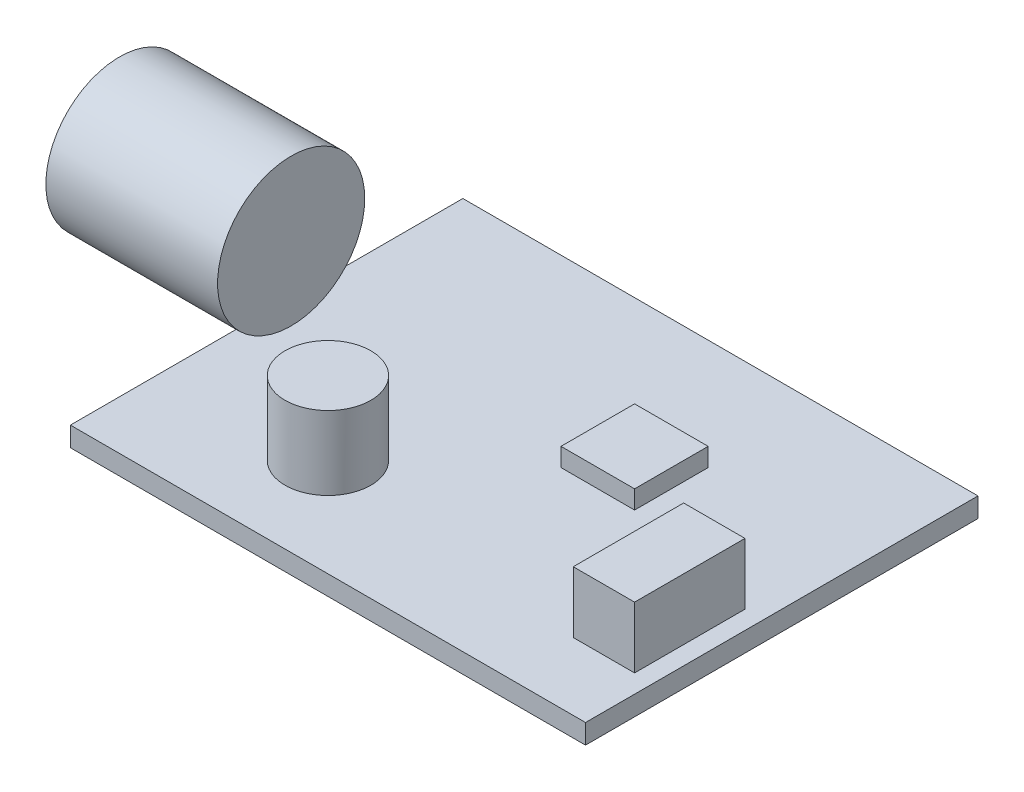
ISO-10303-21;
HEADER;
FILE_DESCRIPTION(('STEP AP214'),'2;1');
FILE_NAME('part.step','',(''),(''),'','','');
FILE_SCHEMA(('AUTOMOTIVE_DESIGN { 1 0 10303 214 1 1 1 1 }'));
ENDSEC;
DATA;
#1=APPLICATION_CONTEXT('core data for automotive mechanical design processes');
#2=APPLICATION_PROTOCOL_DEFINITION('international standard','automotive_design',2000,#1);
#3=PRODUCT_CONTEXT('',#1,'mechanical');
#4=PRODUCT('Part','Part','',(#3));
#5=PRODUCT_RELATED_PRODUCT_CATEGORY('part','',(#4));
#6=PRODUCT_DEFINITION_FORMATION('','',#4);
#7=PRODUCT_DEFINITION_CONTEXT('part definition',#1,'design');
#8=PRODUCT_DEFINITION('design','',#6,#7);
#9=PRODUCT_DEFINITION_SHAPE('','',#8);
#10=(LENGTH_UNIT() NAMED_UNIT(*) SI_UNIT(.MILLI.,.METRE.));
#11=(NAMED_UNIT(*) PLANE_ANGLE_UNIT() SI_UNIT($,.RADIAN.));
#12=(NAMED_UNIT(*) SI_UNIT($,.STERADIAN.) SOLID_ANGLE_UNIT());
#13=UNCERTAINTY_MEASURE_WITH_UNIT(LENGTH_MEASURE(1.E-05),#10,'distance_accuracy_value','');
#14=(GEOMETRIC_REPRESENTATION_CONTEXT(3) GLOBAL_UNCERTAINTY_ASSIGNED_CONTEXT((#13)) GLOBAL_UNIT_ASSIGNED_CONTEXT((#10,
#11,#12)) REPRESENTATION_CONTEXT('',''));
#15=CARTESIAN_POINT('',(0.,0.,0.));
#16=DIRECTION('',(0.,0.,1.));
#17=DIRECTION('',(1.,0.,0.));
#18=AXIS2_PLACEMENT_3D('',#15,#16,#17);
#19=CARTESIAN_POINT('',(-19.,7.6,0.));
#20=DIRECTION('',(-1.,0.,0.));
#21=DIRECTION('',(0.,0.,1.));
#22=AXIS2_PLACEMENT_3D('',#19,#20,#21);
#23=CYLINDRICAL_SURFACE('',#22,6.);
#24=CARTESIAN_POINT('',(-19.,7.6,0.));
#25=DIRECTION('',(1.,0.,0.));
#26=DIRECTION('',(0.,0.,-1.));
#27=AXIS2_PLACEMENT_3D('',#24,#25,#26);
#28=CIRCLE('',#27,6.);
#29=CARTESIAN_POINT('',(-19.,7.6,-6.));
#30=VERTEX_POINT('',#29);
#31=EDGE_CURVE('E11',#30,#30,#28,.T.);
#32=ORIENTED_EDGE('',*,*,#31,.F.);
#33=EDGE_LOOP('',(#32));
#34=FACE_BOUND('',#33,.T.);
#35=CARTESIAN_POINT('',(-33.,7.6,0.));
#36=DIRECTION('',(1.,0.,0.));
#37=DIRECTION('',(0.,0.,-1.));
#38=AXIS2_PLACEMENT_3D('',#35,#36,#37);
#39=CIRCLE('',#38,6.);
#40=CARTESIAN_POINT('',(-33.,7.6,-6.));
#41=VERTEX_POINT('',#40);
#42=EDGE_CURVE('E58',#41,#41,#39,.T.);
#43=ORIENTED_EDGE('',*,*,#42,.T.);
#44=EDGE_LOOP('',(#43));
#45=FACE_BOUND('',#44,.T.);
#46=ADVANCED_FACE('F60',(#34,#45),#23,.T.);
#47=CARTESIAN_POINT('',(-19.,7.6,0.));
#48=DIRECTION('',(1.,0.,0.));
#49=DIRECTION('',(0.,0.,-1.));
#50=AXIS2_PLACEMENT_3D('',#47,#48,#49);
#51=PLANE('',#50);
#52=ORIENTED_EDGE('',*,*,#31,.T.);
#53=EDGE_LOOP('',(#52));
#54=FACE_BOUND('',#53,.T.);
#55=ADVANCED_FACE('F75',(#54),#51,.T.);
#56=CARTESIAN_POINT('',(-33.,7.6,0.));
#57=DIRECTION('',(1.,0.,0.));
#58=DIRECTION('',(0.,0.,-1.));
#59=AXIS2_PLACEMENT_3D('',#56,#57,#58);
#60=PLANE('',#59);
#61=ORIENTED_EDGE('',*,*,#42,.F.);
#62=EDGE_LOOP('',(#61));
#63=FACE_BOUND('',#62,.T.);
#64=ADVANCED_FACE('F68',(#63),#60,.F.);
#65=CLOSED_SHELL('',(#46,#55,#64));
#66=MANIFOLD_SOLID_BREP('B2',#65);
#67=CARTESIAN_POINT('',(0.,1.6,0.));
#68=DIRECTION('',(0.,-1.,0.));
#69=DIRECTION('',(0.,0.,-1.));
#70=AXIS2_PLACEMENT_3D('',#67,#68,#69);
#71=PLANE('',#70);
#72=CARTESIAN_POINT('',(-8.,1.6,8.));
#73=DIRECTION('',(0.,-1.,0.));
#74=DIRECTION('',(0.,0.,-1.));
#75=AXIS2_PLACEMENT_3D('',#72,#73,#74);
#76=CIRCLE('',#75,3.5);
#77=CARTESIAN_POINT('',(-8.,1.6,4.5));
#78=VERTEX_POINT('',#77);
#79=EDGE_CURVE('E54',#78,#78,#76,.F.);
#80=ORIENTED_EDGE('',*,*,#79,.F.);
#81=EDGE_LOOP('',(#80));
#82=FACE_BOUND('',#81,.T.);
#83=DIRECTION('',(0.,0.,-1.));
#84=VECTOR('',#83,1.);
#85=CARTESIAN_POINT('',(8.,1.6,-1.));
#86=LINE('',#85,#84);
#87=CARTESIAN_POINT('',(8.,1.6,-1.));
#88=VERTEX_POINT('',#87);
#89=CARTESIAN_POINT('',(8.,1.6,-7.));
#90=VERTEX_POINT('',#89);
#91=EDGE_CURVE('E221',#88,#90,#86,.T.);
#92=ORIENTED_EDGE('',*,*,#91,.F.);
#93=DIRECTION('',(1.,0.,0.));
#94=VECTOR('',#93,1.);
#95=CARTESIAN_POINT('',(2.,1.6,-1.));
#96=LINE('',#95,#94);
#97=CARTESIAN_POINT('',(2.,1.6,-1.));
#98=VERTEX_POINT('',#97);
#99=EDGE_CURVE('E238',#98,#88,#96,.T.);
#100=ORIENTED_EDGE('',*,*,#99,.F.);
#101=DIRECTION('',(0.,0.,1.));
#102=VECTOR('',#101,1.);
#103=CARTESIAN_POINT('',(2.,1.6,-1.));
#104=LINE('',#103,#102);
#105=CARTESIAN_POINT('',(2.,1.6,-7.));
#106=VERTEX_POINT('',#105);
#107=EDGE_CURVE('E251',#106,#98,#104,.T.);
#108=ORIENTED_EDGE('',*,*,#107,.F.);
#109=DIRECTION('',(-1.,0.,0.));
#110=VECTOR('',#109,1.);
#111=CARTESIAN_POINT('',(2.,1.6,-7.));
#112=LINE('',#111,#110);
#113=EDGE_CURVE('E230',#90,#106,#112,.T.);
#114=ORIENTED_EDGE('',*,*,#113,.F.);
#115=EDGE_LOOP('',(#92,#100,#108,#114));
#116=FACE_BOUND('',#115,.T.);
#117=DIRECTION('',(0.,0.,-1.));
#118=VECTOR('',#117,1.);
#119=CARTESIAN_POINT('',(21.,1.6,16.));
#120=LINE('',#119,#118);
#121=CARTESIAN_POINT('',(21.,1.6,16.));
#122=VERTEX_POINT('',#121);
#123=CARTESIAN_POINT('',(21.,1.6,-16.));
#124=VERTEX_POINT('',#123);
#125=EDGE_CURVE('E277',#122,#124,#120,.T.);
#126=ORIENTED_EDGE('',*,*,#125,.T.);
#127=DIRECTION('',(-1.,0.,0.));
#128=VECTOR('',#127,1.);
#129=CARTESIAN_POINT('',(-21.,1.6,-16.));
#130=LINE('',#129,#128);
#131=CARTESIAN_POINT('',(-21.,1.6,-16.));
#132=VERTEX_POINT('',#131);
#133=EDGE_CURVE('E278',#124,#132,#130,.T.);
#134=ORIENTED_EDGE('',*,*,#133,.T.);
#135=DIRECTION('',(0.,0.,1.));
#136=VECTOR('',#135,1.);
#137=CARTESIAN_POINT('',(-21.,1.6,16.));
#138=LINE('',#137,#136);
#139=CARTESIAN_POINT('',(-21.,1.6,16.));
#140=VERTEX_POINT('',#139);
#141=EDGE_CURVE('E285',#132,#140,#138,.T.);
#142=ORIENTED_EDGE('',*,*,#141,.T.);
#143=DIRECTION('',(1.,0.,0.));
#144=VECTOR('',#143,1.);
#145=CARTESIAN_POINT('',(-21.,1.6,16.));
#146=LINE('',#145,#144);
#147=EDGE_CURVE('E289',#140,#122,#146,.T.);
#148=ORIENTED_EDGE('',*,*,#147,.T.);
#149=EDGE_LOOP('',(#126,#134,#142,#148));
#150=FACE_BOUND('',#149,.T.);
#151=DIRECTION('',(0.,0.,-1.));
#152=VECTOR('',#151,1.);
#153=CARTESIAN_POINT('',(19.5,1.6,10.5));
#154=LINE('',#153,#152);
#155=CARTESIAN_POINT('',(19.5,1.6,10.5));
#156=VERTEX_POINT('',#155);
#157=CARTESIAN_POINT('',(19.5,1.6,1.5));
#158=VERTEX_POINT('',#157);
#159=EDGE_CURVE('E225',#156,#158,#154,.T.);
#160=ORIENTED_EDGE('',*,*,#159,.F.);
#161=DIRECTION('',(1.,0.,0.));
#162=VECTOR('',#161,1.);
#163=CARTESIAN_POINT('',(14.5,1.6,10.5));
#164=LINE('',#163,#162);
#165=CARTESIAN_POINT('',(14.5,1.6,10.5));
#166=VERTEX_POINT('',#165);
#167=EDGE_CURVE('E218',#166,#156,#164,.T.);
#168=ORIENTED_EDGE('',*,*,#167,.F.);
#169=DIRECTION('',(0.,0.,1.));
#170=VECTOR('',#169,1.);
#171=CARTESIAN_POINT('',(14.5,1.6,10.5));
#172=LINE('',#171,#170);
#173=CARTESIAN_POINT('',(14.5,1.6,1.5));
#174=VERTEX_POINT('',#173);
#175=EDGE_CURVE('E133',#174,#166,#172,.T.);
#176=ORIENTED_EDGE('',*,*,#175,.F.);
#177=DIRECTION('',(-1.,0.,0.));
#178=VECTOR('',#177,1.);
#179=CARTESIAN_POINT('',(14.5,1.6,1.5));
#180=LINE('',#179,#178);
#181=EDGE_CURVE('E127',#158,#174,#180,.T.);
#182=ORIENTED_EDGE('',*,*,#181,.F.);
#183=EDGE_LOOP('',(#160,#168,#176,#182));
#184=FACE_BOUND('',#183,.T.);
#185=ADVANCED_FACE('F109',(#82,#116,#150,#184),#71,.F.);
#186=CARTESIAN_POINT('',(21.,1.6,16.));
#187=DIRECTION('',(-1.,0.,0.));
#188=DIRECTION('',(0.,0.,1.));
#189=AXIS2_PLACEMENT_3D('',#186,#187,#188);
#190=PLANE('',#189);
#191=DIRECTION('',(0.,0.,-1.));
#192=VECTOR('',#191,1.);
#193=CARTESIAN_POINT('',(21.,0.,16.));
#194=LINE('',#193,#192);
#195=CARTESIAN_POINT('',(21.,0.,16.));
#196=VERTEX_POINT('',#195);
#197=CARTESIAN_POINT('',(21.,0.,-16.));
#198=VERTEX_POINT('',#197);
#199=EDGE_CURVE('E274',#196,#198,#194,.T.);
#200=ORIENTED_EDGE('',*,*,#199,.T.);
#201=DIRECTION('',(0.,-1.,0.));
#202=VECTOR('',#201,1.);
#203=CARTESIAN_POINT('',(21.,1.6,-16.));
#204=LINE('',#203,#202);
#205=EDGE_CURVE('E120',#124,#198,#204,.T.);
#206=ORIENTED_EDGE('',*,*,#205,.F.);
#207=ORIENTED_EDGE('',*,*,#125,.F.);
#208=DIRECTION('',(0.,-1.,0.));
#209=VECTOR('',#208,1.);
#210=CARTESIAN_POINT('',(21.,1.6,16.));
#211=LINE('',#210,#209);
#212=EDGE_CURVE('E288',#122,#196,#211,.T.);
#213=ORIENTED_EDGE('',*,*,#212,.T.);
#214=EDGE_LOOP('',(#200,#206,#207,#213));
#215=FACE_BOUND('',#214,.T.);
#216=ADVANCED_FACE('F115',(#215),#190,.F.);
#217=CARTESIAN_POINT('',(-21.,1.6,-16.));
#218=DIRECTION('',(0.,0.,1.));
#219=DIRECTION('',(1.,0.,0.));
#220=AXIS2_PLACEMENT_3D('',#217,#218,#219);
#221=PLANE('',#220);
#222=DIRECTION('',(-1.,0.,0.));
#223=VECTOR('',#222,1.);
#224=CARTESIAN_POINT('',(-21.,0.,-16.));
#225=LINE('',#224,#223);
#226=CARTESIAN_POINT('',(-21.,0.,-16.));
#227=VERTEX_POINT('',#226);
#228=EDGE_CURVE('E294',#198,#227,#225,.T.);
#229=ORIENTED_EDGE('',*,*,#228,.T.);
#230=DIRECTION('',(0.,-1.,0.));
#231=VECTOR('',#230,1.);
#232=CARTESIAN_POINT('',(-21.,1.6,-16.));
#233=LINE('',#232,#231);
#234=EDGE_CURVE('E310',#132,#227,#233,.T.);
#235=ORIENTED_EDGE('',*,*,#234,.F.);
#236=ORIENTED_EDGE('',*,*,#133,.F.);
#237=ORIENTED_EDGE('',*,*,#205,.T.);
#238=EDGE_LOOP('',(#229,#235,#236,#237));
#239=FACE_BOUND('',#238,.T.);
#240=ADVANCED_FACE('F316',(#239),#221,.F.);
#241=CARTESIAN_POINT('',(-21.,1.6,16.));
#242=DIRECTION('',(1.,0.,0.));
#243=DIRECTION('',(0.,0.,-1.));
#244=AXIS2_PLACEMENT_3D('',#241,#242,#243);
#245=PLANE('',#244);
#246=DIRECTION('',(0.,0.,1.));
#247=VECTOR('',#246,1.);
#248=CARTESIAN_POINT('',(-21.,0.,16.));
#249=LINE('',#248,#247);
#250=CARTESIAN_POINT('',(-21.,0.,16.));
#251=VERTEX_POINT('',#250);
#252=EDGE_CURVE('E299',#227,#251,#249,.T.);
#253=ORIENTED_EDGE('',*,*,#252,.T.);
#254=DIRECTION('',(0.,-1.,0.));
#255=VECTOR('',#254,1.);
#256=CARTESIAN_POINT('',(-21.,1.6,16.));
#257=LINE('',#256,#255);
#258=EDGE_CURVE('E303',#140,#251,#257,.T.);
#259=ORIENTED_EDGE('',*,*,#258,.F.);
#260=ORIENTED_EDGE('',*,*,#141,.F.);
#261=ORIENTED_EDGE('',*,*,#234,.T.);
#262=EDGE_LOOP('',(#253,#259,#260,#261));
#263=FACE_BOUND('',#262,.T.);
#264=ADVANCED_FACE('F327',(#263),#245,.F.);
#265=CARTESIAN_POINT('',(-21.,1.6,16.));
#266=DIRECTION('',(0.,0.,-1.));
#267=DIRECTION('',(-1.,0.,0.));
#268=AXIS2_PLACEMENT_3D('',#265,#266,#267);
#269=PLANE('',#268);
#270=DIRECTION('',(1.,0.,0.));
#271=VECTOR('',#270,1.);
#272=CARTESIAN_POINT('',(-21.,0.,16.));
#273=LINE('',#272,#271);
#274=EDGE_CURVE('E283',#251,#196,#273,.T.);
#275=ORIENTED_EDGE('',*,*,#274,.T.);
#276=ORIENTED_EDGE('',*,*,#212,.F.);
#277=ORIENTED_EDGE('',*,*,#147,.F.);
#278=ORIENTED_EDGE('',*,*,#258,.T.);
#279=EDGE_LOOP('',(#275,#276,#277,#278));
#280=FACE_BOUND('',#279,.T.);
#281=ADVANCED_FACE('F335',(#280),#269,.F.);
#282=CARTESIAN_POINT('',(0.,0.,0.));
#283=DIRECTION('',(0.,-1.,0.));
#284=DIRECTION('',(0.,0.,-1.));
#285=AXIS2_PLACEMENT_3D('',#282,#283,#284);
#286=PLANE('',#285);
#287=ORIENTED_EDGE('',*,*,#199,.F.);
#288=ORIENTED_EDGE('',*,*,#274,.F.);
#289=ORIENTED_EDGE('',*,*,#252,.F.);
#290=ORIENTED_EDGE('',*,*,#228,.F.);
#291=EDGE_LOOP('',(#287,#288,#289,#290));
#292=FACE_BOUND('',#291,.T.);
#293=ADVANCED_FACE('F322',(#292),#286,.T.);
#294=CARTESIAN_POINT('',(8.,3.1,-1.));
#295=DIRECTION('',(-1.,0.,0.));
#296=DIRECTION('',(0.,0.,1.));
#297=AXIS2_PLACEMENT_3D('',#294,#295,#296);
#298=PLANE('',#297);
#299=ORIENTED_EDGE('',*,*,#91,.T.);
#300=DIRECTION('',(0.,-1.,0.));
#301=VECTOR('',#300,1.);
#302=CARTESIAN_POINT('',(8.,3.1,-7.));
#303=LINE('',#302,#301);
#304=CARTESIAN_POINT('',(8.,3.1,-7.));
#305=VERTEX_POINT('',#304);
#306=EDGE_CURVE('E271',#305,#90,#303,.T.);
#307=ORIENTED_EDGE('',*,*,#306,.F.);
#308=DIRECTION('',(0.,0.,-1.));
#309=VECTOR('',#308,1.);
#310=CARTESIAN_POINT('',(8.,3.1,-1.));
#311=LINE('',#310,#309);
#312=CARTESIAN_POINT('',(8.,3.1,-1.));
#313=VERTEX_POINT('',#312);
#314=EDGE_CURVE('E233',#313,#305,#311,.T.);
#315=ORIENTED_EDGE('',*,*,#314,.F.);
#316=DIRECTION('',(0.,-1.,0.));
#317=VECTOR('',#316,1.);
#318=CARTESIAN_POINT('',(8.,3.1,-1.));
#319=LINE('',#318,#317);
#320=EDGE_CURVE('E250',#313,#88,#319,.T.);
#321=ORIENTED_EDGE('',*,*,#320,.T.);
#322=EDGE_LOOP('',(#299,#307,#315,#321));
#323=FACE_BOUND('',#322,.T.);
#324=ADVANCED_FACE('F379',(#323),#298,.F.);
#325=CARTESIAN_POINT('',(2.,3.1,-7.));
#326=DIRECTION('',(0.,0.,1.));
#327=DIRECTION('',(1.,0.,0.));
#328=AXIS2_PLACEMENT_3D('',#325,#326,#327);
#329=PLANE('',#328);
#330=ORIENTED_EDGE('',*,*,#113,.T.);
#331=DIRECTION('',(0.,-1.,0.));
#332=VECTOR('',#331,1.);
#333=CARTESIAN_POINT('',(2.,3.1,-7.));
#334=LINE('',#333,#332);
#335=CARTESIAN_POINT('',(2.,3.1,-7.));
#336=VERTEX_POINT('',#335);
#337=EDGE_CURVE('E270',#336,#106,#334,.T.);
#338=ORIENTED_EDGE('',*,*,#337,.F.);
#339=DIRECTION('',(-1.,0.,0.));
#340=VECTOR('',#339,1.);
#341=CARTESIAN_POINT('',(2.,3.1,-7.));
#342=LINE('',#341,#340);
#343=EDGE_CURVE('E239',#305,#336,#342,.T.);
#344=ORIENTED_EDGE('',*,*,#343,.F.);
#345=ORIENTED_EDGE('',*,*,#306,.T.);
#346=EDGE_LOOP('',(#330,#338,#344,#345));
#347=FACE_BOUND('',#346,.T.);
#348=ADVANCED_FACE('F389',(#347),#329,.F.);
#349=CARTESIAN_POINT('',(2.,3.1,-1.));
#350=DIRECTION('',(1.,0.,0.));
#351=DIRECTION('',(0.,0.,-1.));
#352=AXIS2_PLACEMENT_3D('',#349,#350,#351);
#353=PLANE('',#352);
#354=ORIENTED_EDGE('',*,*,#107,.T.);
#355=DIRECTION('',(0.,-1.,0.));
#356=VECTOR('',#355,1.);
#357=CARTESIAN_POINT('',(2.,3.1,-1.));
#358=LINE('',#357,#356);
#359=CARTESIAN_POINT('',(2.,3.1,-1.));
#360=VERTEX_POINT('',#359);
#361=EDGE_CURVE('E263',#360,#98,#358,.T.);
#362=ORIENTED_EDGE('',*,*,#361,.F.);
#363=DIRECTION('',(0.,0.,1.));
#364=VECTOR('',#363,1.);
#365=CARTESIAN_POINT('',(2.,3.1,-1.));
#366=LINE('',#365,#364);
#367=EDGE_CURVE('E242',#336,#360,#366,.T.);
#368=ORIENTED_EDGE('',*,*,#367,.F.);
#369=ORIENTED_EDGE('',*,*,#337,.T.);
#370=EDGE_LOOP('',(#354,#362,#368,#369));
#371=FACE_BOUND('',#370,.T.);
#372=ADVANCED_FACE('F387',(#371),#353,.F.);
#373=CARTESIAN_POINT('',(2.,3.1,-1.));
#374=DIRECTION('',(0.,0.,-1.));
#375=DIRECTION('',(-1.,0.,0.));
#376=AXIS2_PLACEMENT_3D('',#373,#374,#375);
#377=PLANE('',#376);
#378=ORIENTED_EDGE('',*,*,#99,.T.);
#379=ORIENTED_EDGE('',*,*,#320,.F.);
#380=DIRECTION('',(1.,0.,0.));
#381=VECTOR('',#380,1.);
#382=CARTESIAN_POINT('',(2.,3.1,-1.));
#383=LINE('',#382,#381);
#384=EDGE_CURVE('E247',#360,#313,#383,.T.);
#385=ORIENTED_EDGE('',*,*,#384,.F.);
#386=ORIENTED_EDGE('',*,*,#361,.T.);
#387=EDGE_LOOP('',(#378,#379,#385,#386));
#388=FACE_BOUND('',#387,.T.);
#389=ADVANCED_FACE('F376',(#388),#377,.F.);
#390=CARTESIAN_POINT('',(0.,3.1,0.));
#391=DIRECTION('',(0.,-1.,0.));
#392=DIRECTION('',(0.,0.,-1.));
#393=AXIS2_PLACEMENT_3D('',#390,#391,#392);
#394=PLANE('',#393);
#395=ORIENTED_EDGE('',*,*,#314,.T.);
#396=ORIENTED_EDGE('',*,*,#343,.T.);
#397=ORIENTED_EDGE('',*,*,#367,.T.);
#398=ORIENTED_EDGE('',*,*,#384,.T.);
#399=EDGE_LOOP('',(#395,#396,#397,#398));
#400=FACE_BOUND('',#399,.T.);
#401=ADVANCED_FACE('F385',(#400),#394,.F.);
#402=CARTESIAN_POINT('',(19.5,6.6,10.5));
#403=DIRECTION('',(-1.,0.,0.));
#404=DIRECTION('',(0.,0.,1.));
#405=AXIS2_PLACEMENT_3D('',#402,#403,#404);
#406=PLANE('',#405);
#407=ORIENTED_EDGE('',*,*,#159,.T.);
#408=DIRECTION('',(0.,-1.,0.));
#409=VECTOR('',#408,1.);
#410=CARTESIAN_POINT('',(19.5,6.6,1.5));
#411=LINE('',#410,#409);
#412=CARTESIAN_POINT('',(19.5,6.6,1.5));
#413=VERTEX_POINT('',#412);
#414=EDGE_CURVE('E203',#413,#158,#411,.T.);
#415=ORIENTED_EDGE('',*,*,#414,.F.);
#416=DIRECTION('',(0.,0.,-1.));
#417=VECTOR('',#416,1.);
#418=CARTESIAN_POINT('',(19.5,6.6,10.5));
#419=LINE('',#418,#417);
#420=CARTESIAN_POINT('',(19.5,6.6,10.5));
#421=VERTEX_POINT('',#420);
#422=EDGE_CURVE('E207',#421,#413,#419,.T.);
#423=ORIENTED_EDGE('',*,*,#422,.F.);
#424=DIRECTION('',(0.,-1.,0.));
#425=VECTOR('',#424,1.);
#426=CARTESIAN_POINT('',(19.5,6.6,10.5));
#427=LINE('',#426,#425);
#428=EDGE_CURVE('E341',#421,#156,#427,.T.);
#429=ORIENTED_EDGE('',*,*,#428,.T.);
#430=EDGE_LOOP('',(#407,#415,#423,#429));
#431=FACE_BOUND('',#430,.T.);
#432=ADVANCED_FACE('F222',(#431),#406,.F.);
#433=CARTESIAN_POINT('',(14.5,6.6,1.5));
#434=DIRECTION('',(0.,0.,1.));
#435=DIRECTION('',(1.,0.,0.));
#436=AXIS2_PLACEMENT_3D('',#433,#434,#435);
#437=PLANE('',#436);
#438=ORIENTED_EDGE('',*,*,#181,.T.);
#439=DIRECTION('',(0.,-1.,0.));
#440=VECTOR('',#439,1.);
#441=CARTESIAN_POINT('',(14.5,6.6,1.5));
#442=LINE('',#441,#440);
#443=CARTESIAN_POINT('',(14.5,6.6,1.5));
#444=VERTEX_POINT('',#443);
#445=EDGE_CURVE('E204',#444,#174,#442,.T.);
#446=ORIENTED_EDGE('',*,*,#445,.F.);
#447=DIRECTION('',(-1.,0.,0.));
#448=VECTOR('',#447,1.);
#449=CARTESIAN_POINT('',(14.5,6.6,1.5));
#450=LINE('',#449,#448);
#451=EDGE_CURVE('E197',#413,#444,#450,.T.);
#452=ORIENTED_EDGE('',*,*,#451,.F.);
#453=ORIENTED_EDGE('',*,*,#414,.T.);
#454=EDGE_LOOP('',(#438,#446,#452,#453));
#455=FACE_BOUND('',#454,.T.);
#456=ADVANCED_FACE('F200',(#455),#437,.F.);
#457=CARTESIAN_POINT('',(14.5,6.6,10.5));
#458=DIRECTION('',(1.,0.,0.));
#459=DIRECTION('',(0.,0.,-1.));
#460=AXIS2_PLACEMENT_3D('',#457,#458,#459);
#461=PLANE('',#460);
#462=ORIENTED_EDGE('',*,*,#175,.T.);
#463=DIRECTION('',(0.,-1.,0.));
#464=VECTOR('',#463,1.);
#465=CARTESIAN_POINT('',(14.5,6.6,10.5));
#466=LINE('',#465,#464);
#467=CARTESIAN_POINT('',(14.5,6.6,10.5));
#468=VERTEX_POINT('',#467);
#469=EDGE_CURVE('E232',#468,#166,#466,.T.);
#470=ORIENTED_EDGE('',*,*,#469,.F.);
#471=DIRECTION('',(0.,0.,1.));
#472=VECTOR('',#471,1.);
#473=CARTESIAN_POINT('',(14.5,6.6,10.5));
#474=LINE('',#473,#472);
#475=EDGE_CURVE('E208',#444,#468,#474,.T.);
#476=ORIENTED_EDGE('',*,*,#475,.F.);
#477=ORIENTED_EDGE('',*,*,#445,.T.);
#478=EDGE_LOOP('',(#462,#470,#476,#477));
#479=FACE_BOUND('',#478,.T.);
#480=ADVANCED_FACE('F502',(#479),#461,.F.);
#481=CARTESIAN_POINT('',(14.5,6.6,10.5));
#482=DIRECTION('',(0.,0.,-1.));
#483=DIRECTION('',(-1.,0.,0.));
#484=AXIS2_PLACEMENT_3D('',#481,#482,#483);
#485=PLANE('',#484);
#486=ORIENTED_EDGE('',*,*,#167,.T.);
#487=ORIENTED_EDGE('',*,*,#428,.F.);
#488=DIRECTION('',(1.,0.,0.));
#489=VECTOR('',#488,1.);
#490=CARTESIAN_POINT('',(14.5,6.6,10.5));
#491=LINE('',#490,#489);
#492=EDGE_CURVE('E212',#468,#421,#491,.T.);
#493=ORIENTED_EDGE('',*,*,#492,.F.);
#494=ORIENTED_EDGE('',*,*,#469,.T.);
#495=EDGE_LOOP('',(#486,#487,#493,#494));
#496=FACE_BOUND('',#495,.T.);
#497=ADVANCED_FACE('F345',(#496),#485,.F.);
#498=CARTESIAN_POINT('',(0.,6.6,0.));
#499=DIRECTION('',(0.,-1.,0.));
#500=DIRECTION('',(0.,0.,-1.));
#501=AXIS2_PLACEMENT_3D('',#498,#499,#500);
#502=PLANE('',#501);
#503=ORIENTED_EDGE('',*,*,#422,.T.);
#504=ORIENTED_EDGE('',*,*,#451,.T.);
#505=ORIENTED_EDGE('',*,*,#475,.T.);
#506=ORIENTED_EDGE('',*,*,#492,.T.);
#507=EDGE_LOOP('',(#503,#504,#505,#506));
#508=FACE_BOUND('',#507,.T.);
#509=ADVANCED_FACE('F215',(#508),#502,.F.);
#510=CARTESIAN_POINT('',(-8.,7.6,8.));
#511=DIRECTION('',(0.,-1.,0.));
#512=DIRECTION('',(0.,0.,-1.));
#513=AXIS2_PLACEMENT_3D('',#510,#511,#512);
#514=CYLINDRICAL_SURFACE('',#513,3.5);
#515=CARTESIAN_POINT('',(-8.,7.6,8.));
#516=DIRECTION('',(0.,1.,0.));
#517=DIRECTION('',(0.,0.,1.));
#518=AXIS2_PLACEMENT_3D('',#515,#516,#517);
#519=CIRCLE('',#518,3.5);
#520=CARTESIAN_POINT('',(-8.,7.6,11.5));
#521=VERTEX_POINT('',#520);
#522=EDGE_CURVE('E340',#521,#521,#519,.T.);
#523=ORIENTED_EDGE('',*,*,#522,.F.);
#524=EDGE_LOOP('',(#523));
#525=FACE_BOUND('',#524,.T.);
#526=ORIENTED_EDGE('',*,*,#79,.T.);
#527=EDGE_LOOP('',(#526));
#528=FACE_BOUND('',#527,.T.);
#529=ADVANCED_FACE('F368',(#525,#528),#514,.T.);
#530=CARTESIAN_POINT('',(-8.,7.6,8.));
#531=DIRECTION('',(0.,1.,0.));
#532=DIRECTION('',(0.,0.,1.));
#533=AXIS2_PLACEMENT_3D('',#530,#531,#532);
#534=PLANE('',#533);
#535=ORIENTED_EDGE('',*,*,#522,.T.);
#536=EDGE_LOOP('',(#535));
#537=FACE_BOUND('',#536,.T.);
#538=ADVANCED_FACE('F365',(#537),#534,.T.);
#539=CLOSED_SHELL('',(#185,#216,#240,#264,#281,#293,#324,#348,#372,#389,#401,#432,#456,#480,
#497,#509,#529,#538));
#540=MANIFOLD_SOLID_BREP('B6',#539);
#541=ADVANCED_BREP_SHAPE_REPRESENTATION('',(#18,#66,#540),#14);
#542=SHAPE_DEFINITION_REPRESENTATION(#9,#541);
ENDSEC;
END-ISO-10303-21;
